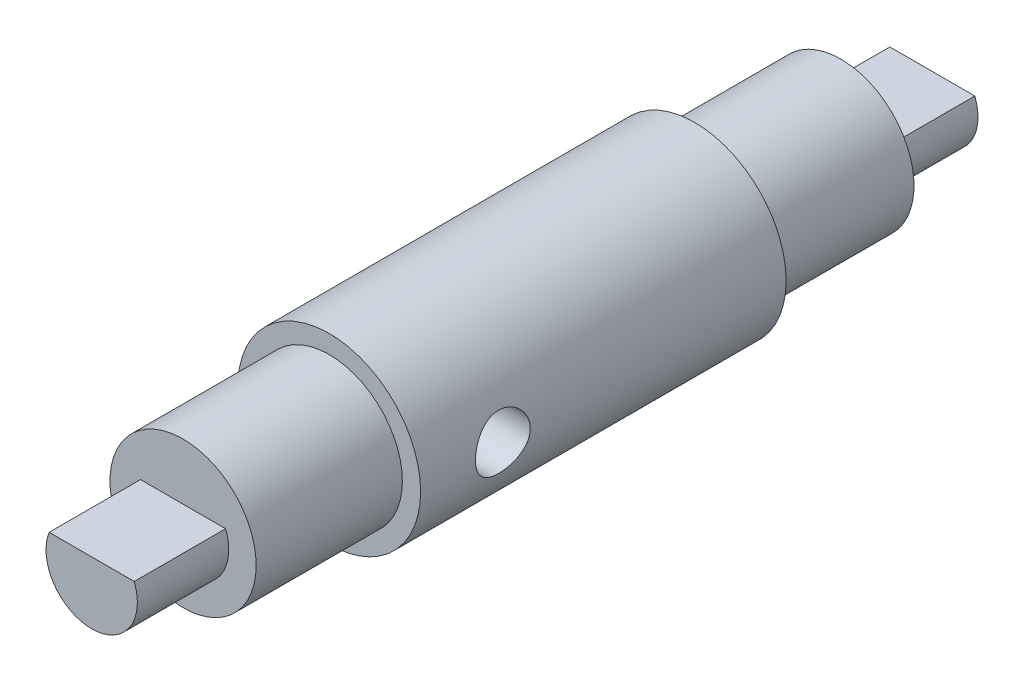
ISO-10303-21;
HEADER;
FILE_DESCRIPTION(('STEP AP214'),'2;1');
FILE_NAME('part.step','',(''),(''),'','','');
FILE_SCHEMA(('AUTOMOTIVE_DESIGN { 1 0 10303 214 1 1 1 1 }'));
ENDSEC;
DATA;
#1=APPLICATION_CONTEXT('core data for automotive mechanical design processes');
#2=APPLICATION_PROTOCOL_DEFINITION('international standard','automotive_design',2000,#1);
#3=PRODUCT_CONTEXT('',#1,'mechanical');
#4=PRODUCT('Part','Part','',(#3));
#5=PRODUCT_RELATED_PRODUCT_CATEGORY('part','',(#4));
#6=PRODUCT_DEFINITION_FORMATION('','',#4);
#7=PRODUCT_DEFINITION_CONTEXT('part definition',#1,'design');
#8=PRODUCT_DEFINITION('design','',#6,#7);
#9=PRODUCT_DEFINITION_SHAPE('','',#8);
#10=(LENGTH_UNIT() NAMED_UNIT(*) SI_UNIT(.MILLI.,.METRE.));
#11=(NAMED_UNIT(*) PLANE_ANGLE_UNIT() SI_UNIT($,.RADIAN.));
#12=(NAMED_UNIT(*) SI_UNIT($,.STERADIAN.) SOLID_ANGLE_UNIT());
#13=UNCERTAINTY_MEASURE_WITH_UNIT(LENGTH_MEASURE(1.E-05),#10,'distance_accuracy_value','');
#14=(GEOMETRIC_REPRESENTATION_CONTEXT(3) GLOBAL_UNCERTAINTY_ASSIGNED_CONTEXT((#13)) GLOBAL_UNIT_ASSIGNED_CONTEXT((#10,
#11,#12)) REPRESENTATION_CONTEXT('',''));
#15=CARTESIAN_POINT('',(0.,0.,0.));
#16=DIRECTION('',(0.,0.,1.));
#17=DIRECTION('',(1.,0.,0.));
#18=AXIS2_PLACEMENT_3D('',#15,#16,#17);
#19=CARTESIAN_POINT('',(0.,0.,20.));
#20=DIRECTION('',(0.,0.,-1.));
#21=DIRECTION('',(-1.,0.,0.));
#22=AXIS2_PLACEMENT_3D('',#19,#20,#21);
#23=CYLINDRICAL_SURFACE('',#22,5.);
#24=CARTESIAN_POINT('',(5.,0.,17.));
#25=CARTESIAN_POINT('',(4.9999992925055,0.0822886127532998,16.9999990025151));
#26=CARTESIAN_POINT('',(4.99794915693954,0.164587318351529,16.993206136376));
#27=CARTESIAN_POINT('',(4.98997105593691,0.32678812530488,16.9662786457779));
#28=CARTESIAN_POINT('',(4.98404193389692,0.406689504411419,16.9461400419767));
#29=CARTESIAN_POINT('',(4.96895552501836,0.561732707754525,16.8932539830897));
#30=CARTESIAN_POINT('',(4.95980300250425,0.636881364395371,16.8605251303811));
#31=CARTESIAN_POINT('',(4.93922109237645,0.78062418105313,16.7834639069442));
#32=CARTESIAN_POINT('',(4.92779140192067,0.849217467469667,16.7391299926046));
#33=CARTESIAN_POINT('',(4.90350737192774,0.979871797183742,16.6387759925273));
#34=CARTESIAN_POINT('',(4.89062383657036,1.04171807124434,16.5824833741141));
#35=CARTESIAN_POINT('',(4.86505834210442,1.15524920923323,16.4603907700898));
#36=CARTESIAN_POINT('',(4.85237641724501,1.20693236327441,16.394589187875));
#37=CARTESIAN_POINT('',(4.82834113993772,1.29980037723707,16.2535292469624));
#38=CARTESIAN_POINT('',(4.81702406663875,1.34072309022213,16.1780915390093));
#39=CARTESIAN_POINT('',(4.79743620394031,1.4092139477476,16.0210107457697));
#40=CARTESIAN_POINT('',(4.78916468313311,1.43678529919973,15.939369156072));
#41=CARTESIAN_POINT('',(4.77690870838434,1.47701633682652,15.7746097338695));
#42=CARTESIAN_POINT('',(4.77281069324533,1.49007196234677,15.6915972561361));
#43=CARTESIAN_POINT('',(4.76902789749767,1.50213730614672,15.5244668437832));
#44=CARTESIAN_POINT('',(4.76934204760571,1.50115042761078,15.4403491819409));
#45=CARTESIAN_POINT('',(4.77424744067778,1.48546977199812,15.2766160913915));
#46=CARTESIAN_POINT('',(4.77868388599141,1.47127205262685,15.1969477496378));
#47=CARTESIAN_POINT('',(4.79108356228624,1.43037420427056,15.0411802137265));
#48=CARTESIAN_POINT('',(4.79904714132351,1.40367284141641,14.9650813726257));
#49=CARTESIAN_POINT('',(4.81772733074973,1.33816026653682,14.8173996503393));
#50=CARTESIAN_POINT('',(4.82848016115952,1.29918816934642,14.7458929160447));
#51=CARTESIAN_POINT('',(4.85150987000065,1.21035222588683,14.6102679779898));
#52=CARTESIAN_POINT('',(4.86378711746991,1.16048574002588,14.5461515705862));
#53=CARTESIAN_POINT('',(4.88911011297937,1.04881290765546,14.424313809238));
#54=CARTESIAN_POINT('',(4.90216654310498,0.986594907466971,14.3669713359703));
#55=CARTESIAN_POINT('',(4.92712244063259,0.853263259313966,14.2634460159358));
#56=CARTESIAN_POINT('',(4.9390218351841,0.782149051860888,14.2172638715856));
#57=CARTESIAN_POINT('',(4.9604316006947,0.632355038342803,14.1371400775353));
#58=CARTESIAN_POINT('',(4.96992543668314,0.553627749747951,14.1032824837501));
#59=CARTESIAN_POINT('',(4.98533521832222,0.391245415603519,14.0494004099004));
#60=CARTESIAN_POINT('',(4.99125216186999,0.307591751589581,14.0293720714675));
#61=CARTESIAN_POINT('',(4.99868364643538,0.140952242668331,14.0043478221006));
#62=CARTESIAN_POINT('',(5.0003485041779,0.0580500976011864,13.9988384141984));
#63=CARTESIAN_POINT('',(4.9995292324176,-0.107499605823383,14.0015691557121));
#64=CARTESIAN_POINT('',(4.99704565677756,-0.19014719669078,14.0098074696514));
#65=CARTESIAN_POINT('',(4.98830696987163,-0.350903605309696,14.0393846111115));
#66=CARTESIAN_POINT('',(4.98213829799417,-0.429072772614169,14.0604233875809));
#67=CARTESIAN_POINT('',(4.96674347841533,-0.580754638954521,14.1146432327782));
#68=CARTESIAN_POINT('',(4.95751696321085,-0.654266777025582,14.1478257610379));
#69=CARTESIAN_POINT('',(4.93669654351325,-0.796437189461051,14.2262531654811));
#70=CARTESIAN_POINT('',(4.92505280829675,-0.864943826199669,14.271759340948));
#71=CARTESIAN_POINT('',(4.90073468764318,-0.993523307980146,14.3732247540528));
#72=CARTESIAN_POINT('',(4.8880600443108,-1.05359403235593,14.4291866118877));
#73=CARTESIAN_POINT('',(4.86253171869138,-1.16585744551027,14.5523873083693));
#74=CARTESIAN_POINT('',(4.84968825033268,-1.21768481231503,14.6199618757717));
#75=CARTESIAN_POINT('',(4.82576515238463,-1.30928995072153,14.7631279390135));
#76=CARTESIAN_POINT('',(4.81468547654651,-1.34906803829472,14.8387192245582));
#77=CARTESIAN_POINT('',(4.79567189615055,-1.41517347127168,14.9955324912547));
#78=CARTESIAN_POINT('',(4.78772337843827,-1.4415634693705,15.0767261865366));
#79=CARTESIAN_POINT('',(4.77591594362794,-1.48021730815114,15.2426879689315));
#80=CARTESIAN_POINT('',(4.772055625083,-1.49248598978779,15.3274548207877));
#81=CARTESIAN_POINT('',(4.76899972496087,-1.50221984485059,15.4943615183762));
#82=CARTESIAN_POINT('',(4.76961647442754,-1.5002805530849,15.5764636510176));
#83=CARTESIAN_POINT('',(4.77499401288294,-1.48307505444813,15.7391141033728));
#84=CARTESIAN_POINT('',(4.77975463592551,-1.46780938124716,15.8196624851764));
#85=CARTESIAN_POINT('',(4.79275763670386,-1.42476888804136,15.9759453991429));
#86=CARTESIAN_POINT('',(4.80095604545965,-1.39715175507068,16.0517272873617));
#87=CARTESIAN_POINT('',(4.81990278909136,-1.33031507121129,16.1976424388177));
#88=CARTESIAN_POINT('',(4.83065161194312,-1.29109329962876,16.2677746176408));
#89=CARTESIAN_POINT('',(4.85397676425833,-1.20048763805072,16.4031631165271));
#90=CARTESIAN_POINT('',(4.86660540163798,-1.14871276092994,16.4681487612604));
#91=CARTESIAN_POINT('',(4.89201320450026,-1.03517434629782,16.5887024983079));
#92=CARTESIAN_POINT('',(4.90479240823905,-0.973408217134498,16.6442681394678));
#93=CARTESIAN_POINT('',(4.92950936570649,-0.839465762183245,16.746023412295));
#94=CARTESIAN_POINT('',(4.94141159765674,-0.767037885790606,16.7918914468555));
#95=CARTESIAN_POINT('',(4.96260680455813,-0.615141373983529,16.870735169904));
#96=CARTESIAN_POINT('',(4.97190099931067,-0.535676052998955,16.9037168882745));
#97=CARTESIAN_POINT('',(4.98602174969301,-0.380757712655282,16.9528952756527));
#98=CARTESIAN_POINT('',(4.99122027381068,-0.305786961954234,16.9705116728832));
#99=CARTESIAN_POINT('',(4.99820944494492,-0.15388019523078,16.9940635252416));
#100=CARTESIAN_POINT('',(5.0000006615474,-0.0769445098581397,17.0000009327048));
#101=CARTESIAN_POINT('',(5.,0.,17.));
#102=B_SPLINE_CURVE_WITH_KNOTS('',3,(#24,#25,#26,#27,#28,#29,#30,#31,#32,#33,#34,#35,#36,#37,
#38,#39,#40,#41,#42,#43,#44,#45,#46,#47,#48,#49,#50,#51,#52,#53,#54,#55,#56,#57,#58,#59,#60,#61,
#62,#63,#64,#65,#66,#67,#68,#69,#70,#71,#72,#73,#74,#75,#76,#77,#78,#79,#80,#81,#82,#83,#84,#85,
#86,#87,#88,#89,#90,#91,#92,#93,#94,#95,#96,#97,#98,#99,#100,#101),.UNSPECIFIED.,.T.,.F.,(4,2,2,
2,2,2,2,2,2,2,2,2,2,2,2,2,2,2,2,2,2,2,2,2,2,2,2,2,2,2,2,2,2,2,2,2,2,2,4),(0.,0.24658320361261,
0.493239964845999,0.739533676300872,0.9858601644127,1.23855602948191,1.49129437288633,
1.74971481004109,2.00807314543223,2.25919689356599,2.51025978319089,2.75226016697676,
2.99428443658001,3.23962426447119,3.48502360158555,3.74067104048166,3.99633456531071,
4.25371046881688,4.51101453528807,4.75908809438545,5.00712853550326,5.24956746682326,
5.49203554593728,5.74011305702908,5.9882528200019,6.24540400322818,6.5025484425268,
6.75847814951251,7.01432009460282,7.25950155466942,7.50467319661599,7.7468004040272,
7.98897397553106,8.2399692567993,8.49102974897501,8.7494299615667,9.00770911595234,
9.23831691930458,9.46888616948873),.UNSPECIFIED.);
#103=CARTESIAN_POINT('',(5.,0.,17.));
#104=VERTEX_POINT('',#103);
#105=EDGE_CURVE('E104',#104,#104,#102,.T.);
#106=ORIENTED_EDGE('',*,*,#105,.T.);
#107=EDGE_LOOP('',(#106));
#108=FACE_BOUND('',#107,.T.);
#109=CARTESIAN_POINT('',(-5.,0.,17.));
#110=CARTESIAN_POINT('',(-4.9999992925055,-0.0822886127532999,16.9999990025151));
#111=CARTESIAN_POINT('',(-4.99794915693954,-0.164587318351529,16.993206136376));
#112=CARTESIAN_POINT('',(-4.98997105593691,-0.32678812530488,16.9662786457779));
#113=CARTESIAN_POINT('',(-4.98404193389692,-0.406689504411419,16.9461400419767));
#114=CARTESIAN_POINT('',(-4.96895552501836,-0.561732707754525,16.8932539830897));
#115=CARTESIAN_POINT('',(-4.95980300250425,-0.636881364395371,16.8605251303811));
#116=CARTESIAN_POINT('',(-4.93922109237645,-0.780624181053129,16.7834639069442));
#117=CARTESIAN_POINT('',(-4.92779140192067,-0.849217467469667,16.7391299926046));
#118=CARTESIAN_POINT('',(-4.90350737192774,-0.979871797183743,16.6387759925273));
#119=CARTESIAN_POINT('',(-4.89062383657036,-1.04171807124434,16.5824833741141));
#120=CARTESIAN_POINT('',(-4.86505834210442,-1.15524920923323,16.4603907700898));
#121=CARTESIAN_POINT('',(-4.85237641724501,-1.20693236327441,16.394589187875));
#122=CARTESIAN_POINT('',(-4.82834113993772,-1.29980037723707,16.2535292469624));
#123=CARTESIAN_POINT('',(-4.81702406663875,-1.34072309022213,16.1780915390093));
#124=CARTESIAN_POINT('',(-4.79743620394031,-1.4092139477476,16.0210107457697));
#125=CARTESIAN_POINT('',(-4.78916468313311,-1.43678529919973,15.939369156072));
#126=CARTESIAN_POINT('',(-4.77690870838434,-1.47701633682652,15.7746097338695));
#127=CARTESIAN_POINT('',(-4.77281069324533,-1.49007196234677,15.6915972561361));
#128=CARTESIAN_POINT('',(-4.76902789749767,-1.50213730614672,15.5244668437832));
#129=CARTESIAN_POINT('',(-4.76934204760571,-1.50115042761078,15.4403491819409));
#130=CARTESIAN_POINT('',(-4.77424744067778,-1.48546977199812,15.2766160913915));
#131=CARTESIAN_POINT('',(-4.77868388599141,-1.47127205262685,15.1969477496378));
#132=CARTESIAN_POINT('',(-4.79108356228624,-1.43037420427056,15.0411802137265));
#133=CARTESIAN_POINT('',(-4.79904714132351,-1.40367284141641,14.9650813726257));
#134=CARTESIAN_POINT('',(-4.81772733074973,-1.33816026653682,14.8173996503393));
#135=CARTESIAN_POINT('',(-4.82848016115952,-1.29918816934642,14.7458929160447));
#136=CARTESIAN_POINT('',(-4.85150987000065,-1.21035222588683,14.6102679779898));
#137=CARTESIAN_POINT('',(-4.86378711746991,-1.16048574002588,14.5461515705862));
#138=CARTESIAN_POINT('',(-4.88911011297937,-1.04881290765546,14.424313809238));
#139=CARTESIAN_POINT('',(-4.90216654310498,-0.986594907466972,14.3669713359703));
#140=CARTESIAN_POINT('',(-4.92712244063259,-0.853263259313967,14.2634460159358));
#141=CARTESIAN_POINT('',(-4.9390218351841,-0.782149051860888,14.2172638715856));
#142=CARTESIAN_POINT('',(-4.9604316006947,-0.632355038342803,14.1371400775353));
#143=CARTESIAN_POINT('',(-4.96992543668314,-0.553627749747951,14.1032824837501));
#144=CARTESIAN_POINT('',(-4.98533521832222,-0.39124541560352,14.0494004099004));
#145=CARTESIAN_POINT('',(-4.99125216186999,-0.307591751589581,14.0293720714675));
#146=CARTESIAN_POINT('',(-4.99868364643538,-0.140952242668331,14.0043478221006));
#147=CARTESIAN_POINT('',(-5.0003485041779,-0.0580500976011866,13.9988384141984));
#148=CARTESIAN_POINT('',(-4.9995292324176,0.107499605823383,14.0015691557121));
#149=CARTESIAN_POINT('',(-4.99704565677756,0.19014719669078,14.0098074696514));
#150=CARTESIAN_POINT('',(-4.98830696987163,0.350903605309696,14.0393846111115));
#151=CARTESIAN_POINT('',(-4.98213829799417,0.429072772614168,14.0604233875809));
#152=CARTESIAN_POINT('',(-4.96674347841533,0.580754638954521,14.1146432327782));
#153=CARTESIAN_POINT('',(-4.95751696321085,0.654266777025582,14.1478257610379));
#154=CARTESIAN_POINT('',(-4.93669654351325,0.796437189461051,14.2262531654811));
#155=CARTESIAN_POINT('',(-4.92505280829675,0.864943826199669,14.271759340948));
#156=CARTESIAN_POINT('',(-4.90073468764318,0.993523307980146,14.3732247540528));
#157=CARTESIAN_POINT('',(-4.8880600443108,1.05359403235593,14.4291866118877));
#158=CARTESIAN_POINT('',(-4.86253171869138,1.16585744551027,14.5523873083693));
#159=CARTESIAN_POINT('',(-4.84968825033268,1.21768481231503,14.6199618757717));
#160=CARTESIAN_POINT('',(-4.82576515238463,1.30928995072153,14.7631279390135));
#161=CARTESIAN_POINT('',(-4.81468547654651,1.34906803829472,14.8387192245582));
#162=CARTESIAN_POINT('',(-4.79567189615055,1.41517347127168,14.9955324912547));
#163=CARTESIAN_POINT('',(-4.78772337843827,1.4415634693705,15.0767261865366));
#164=CARTESIAN_POINT('',(-4.77591594362794,1.48021730815114,15.2426879689315));
#165=CARTESIAN_POINT('',(-4.772055625083,1.49248598978779,15.3274548207877));
#166=CARTESIAN_POINT('',(-4.76899972496087,1.50221984485059,15.4943615183762));
#167=CARTESIAN_POINT('',(-4.76961647442754,1.5002805530849,15.5764636510176));
#168=CARTESIAN_POINT('',(-4.77499401288294,1.48307505444813,15.7391141033728));
#169=CARTESIAN_POINT('',(-4.77975463592551,1.46780938124716,15.8196624851764));
#170=CARTESIAN_POINT('',(-4.79275763670386,1.42476888804136,15.9759453991429));
#171=CARTESIAN_POINT('',(-4.80095604545965,1.39715175507068,16.0517272873617));
#172=CARTESIAN_POINT('',(-4.81990278909136,1.33031507121129,16.1976424388177));
#173=CARTESIAN_POINT('',(-4.83065161194312,1.29109329962876,16.2677746176408));
#174=CARTESIAN_POINT('',(-4.85397676425833,1.20048763805072,16.4031631165271));
#175=CARTESIAN_POINT('',(-4.86660540163798,1.14871276092993,16.4681487612604));
#176=CARTESIAN_POINT('',(-4.89201320450026,1.03517434629781,16.5887024983079));
#177=CARTESIAN_POINT('',(-4.90479240823905,0.973408217134497,16.6442681394678));
#178=CARTESIAN_POINT('',(-4.92950936570649,0.839465762183246,16.746023412295));
#179=CARTESIAN_POINT('',(-4.94141159765674,0.767037885790606,16.7918914468555));
#180=CARTESIAN_POINT('',(-4.96260680455813,0.61514137398353,16.870735169904));
#181=CARTESIAN_POINT('',(-4.97190099931067,0.535676052998955,16.9037168882745));
#182=CARTESIAN_POINT('',(-4.98602174969301,0.380757712655282,16.9528952756527));
#183=CARTESIAN_POINT('',(-4.99122027381068,0.305786961954235,16.9705116728832));
#184=CARTESIAN_POINT('',(-4.99820944494492,0.15388019523078,16.9940635252416));
#185=CARTESIAN_POINT('',(-5.0000006615474,0.0769445098581401,17.0000009327048));
#186=CARTESIAN_POINT('',(-5.,0.,17.));
#187=B_SPLINE_CURVE_WITH_KNOTS('',3,(#109,#110,#111,#112,#113,#114,#115,#116,#117,#118,#119,
#120,#121,#122,#123,#124,#125,#126,#127,#128,#129,#130,#131,#132,#133,#134,#135,#136,#137,#138,
#139,#140,#141,#142,#143,#144,#145,#146,#147,#148,#149,#150,#151,#152,#153,#154,#155,#156,#157,
#158,#159,#160,#161,#162,#163,#164,#165,#166,#167,#168,#169,#170,#171,#172,#173,#174,#175,#176,
#177,#178,#179,#180,#181,#182,#183,#184,#185,#186),.UNSPECIFIED.,.T.,.F.,(4,2,2,2,2,2,2,2,2,2,2,
2,2,2,2,2,2,2,2,2,2,2,2,2,2,2,2,2,2,2,2,2,2,2,2,2,2,2,4),(0.,0.24658320361261,0.493239964845999,
0.739533676300872,0.9858601644127,1.23855602948191,1.49129437288633,1.74971481004109,
2.00807314543223,2.25919689356599,2.51025978319089,2.75226016697676,2.99428443658001,
3.23962426447119,3.48502360158555,3.74067104048166,3.99633456531071,4.25371046881688,
4.51101453528807,4.75908809438545,5.00712853550326,5.24956746682326,5.49203554593728,
5.74011305702908,5.9882528200019,6.24540400322818,6.5025484425268,6.75847814951251,
7.01432009460282,7.25950155466942,7.50467319661599,7.7468004040272,7.98897397553107,
8.23996925679931,8.49102974897502,8.7494299615667,9.00770911595234,9.23831691930459,
9.46888616948874),.UNSPECIFIED.);
#188=CARTESIAN_POINT('',(-5.,0.,17.));
#189=VERTEX_POINT('',#188);
#190=EDGE_CURVE('E48',#189,#189,#187,.T.);
#191=ORIENTED_EDGE('',*,*,#190,.T.);
#192=EDGE_LOOP('',(#191));
#193=FACE_BOUND('',#192,.T.);
#194=CARTESIAN_POINT('',(0.,0.,20.));
#195=DIRECTION('',(0.,0.,1.));
#196=DIRECTION('',(1.,0.,0.));
#197=AXIS2_PLACEMENT_3D('',#194,#195,#196);
#198=CIRCLE('',#197,5.);
#199=CARTESIAN_POINT('',(5.,0.,20.));
#200=VERTEX_POINT('',#199);
#201=EDGE_CURVE('E120',#200,#200,#198,.T.);
#202=ORIENTED_EDGE('',*,*,#201,.F.);
#203=EDGE_LOOP('',(#202));
#204=FACE_BOUND('',#203,.T.);
#205=CARTESIAN_POINT('',(0.,0.,0.));
#206=DIRECTION('',(0.,0.,1.));
#207=DIRECTION('',(1.,0.,0.));
#208=AXIS2_PLACEMENT_3D('',#205,#206,#207);
#209=CIRCLE('',#208,5.);
#210=CARTESIAN_POINT('',(5.,0.,0.));
#211=VERTEX_POINT('',#210);
#212=EDGE_CURVE('E119',#211,#211,#209,.T.);
#213=ORIENTED_EDGE('',*,*,#212,.T.);
#214=EDGE_LOOP('',(#213));
#215=FACE_BOUND('',#214,.T.);
#216=ADVANCED_FACE('F40',(#108,#193,#204,#215),#23,.T.);
#217=CARTESIAN_POINT('',(0.,0.,20.));
#218=DIRECTION('',(0.,0.,1.));
#219=DIRECTION('',(1.,0.,0.));
#220=AXIS2_PLACEMENT_3D('',#217,#218,#219);
#221=PLANE('',#220);
#222=CARTESIAN_POINT('',(0.,0.,20.));
#223=DIRECTION('',(0.,0.,1.));
#224=DIRECTION('',(1.,0.,0.));
#225=AXIS2_PLACEMENT_3D('',#222,#223,#224);
#226=CIRCLE('',#225,4.);
#227=CARTESIAN_POINT('',(4.,0.,20.));
#228=VERTEX_POINT('',#227);
#229=EDGE_CURVE('E11',#228,#228,#226,.T.);
#230=ORIENTED_EDGE('',*,*,#229,.F.);
#231=EDGE_LOOP('',(#230));
#232=FACE_BOUND('',#231,.T.);
#233=ORIENTED_EDGE('',*,*,#201,.T.);
#234=EDGE_LOOP('',(#233));
#235=FACE_BOUND('',#234,.T.);
#236=ADVANCED_FACE('F168',(#232,#235),#221,.T.);
#237=CARTESIAN_POINT('',(0.,0.,0.));
#238=DIRECTION('',(0.,0.,1.));
#239=DIRECTION('',(1.,0.,0.));
#240=AXIS2_PLACEMENT_3D('',#237,#238,#239);
#241=PLANE('',#240);
#242=CARTESIAN_POINT('',(0.,0.,0.));
#243=DIRECTION('',(0.,0.,1.));
#244=DIRECTION('',(1.,0.,0.));
#245=AXIS2_PLACEMENT_3D('',#242,#243,#244);
#246=CIRCLE('',#245,4.);
#247=CARTESIAN_POINT('',(4.,0.,0.));
#248=VERTEX_POINT('',#247);
#249=EDGE_CURVE('E101',#248,#248,#246,.F.);
#250=ORIENTED_EDGE('',*,*,#249,.F.);
#251=EDGE_LOOP('',(#250));
#252=FACE_BOUND('',#251,.T.);
#253=ORIENTED_EDGE('',*,*,#212,.F.);
#254=EDGE_LOOP('',(#253));
#255=FACE_BOUND('',#254,.T.);
#256=ADVANCED_FACE('F139',(#252,#255),#241,.F.);
#257=CARTESIAN_POINT('',(10.,0.,15.5));
#258=DIRECTION('',(-1.,0.,0.));
#259=DIRECTION('',(0.,0.,1.));
#260=AXIS2_PLACEMENT_3D('',#257,#258,#259);
#261=CYLINDRICAL_SURFACE('',#260,1.5);
#262=ORIENTED_EDGE('',*,*,#105,.F.);
#263=EDGE_LOOP('',(#262));
#264=FACE_BOUND('',#263,.T.);
#265=ORIENTED_EDGE('',*,*,#190,.F.);
#266=EDGE_LOOP('',(#265));
#267=FACE_BOUND('',#266,.T.);
#268=ADVANCED_FACE('F133',(#264,#267),#261,.F.);
#269=CARTESIAN_POINT('',(0.,0.,33.002));
#270=DIRECTION('',(0.,0.,-1.));
#271=DIRECTION('',(-1.,0.,0.));
#272=AXIS2_PLACEMENT_3D('',#269,#270,#271);
#273=CYLINDRICAL_SURFACE('',#272,4.);
#274=CARTESIAN_POINT('',(0.,0.,-8.));
#275=DIRECTION('',(0.,0.,-1.));
#276=DIRECTION('',(-1.,0.,0.));
#277=AXIS2_PLACEMENT_3D('',#274,#275,#276);
#278=CIRCLE('',#277,4.);
#279=CARTESIAN_POINT('',(-4.,0.,-8.));
#280=VERTEX_POINT('',#279);
#281=EDGE_CURVE('E191',#280,#280,#278,.T.);
#282=ORIENTED_EDGE('',*,*,#281,.F.);
#283=EDGE_LOOP('',(#282));
#284=FACE_BOUND('',#283,.T.);
#285=ORIENTED_EDGE('',*,*,#249,.T.);
#286=EDGE_LOOP('',(#285));
#287=FACE_BOUND('',#286,.T.);
#288=ADVANCED_FACE('F138',(#284,#287),#273,.T.);
#289=CARTESIAN_POINT('',(0.,0.,-13.));
#290=DIRECTION('',(0.,0.,-1.));
#291=DIRECTION('',(-1.,0.,0.));
#292=AXIS2_PLACEMENT_3D('',#289,#290,#291);
#293=PLANE('',#292);
#294=DIRECTION('',(-1.,0.,0.));
#295=VECTOR('',#294,1.);
#296=CARTESIAN_POINT('',(0.,0.913986653585557,-13.));
#297=LINE('',#296,#295);
#298=CARTESIAN_POINT('',(2.32693540887311,0.913986653585557,-13.));
#299=VERTEX_POINT('',#298);
#300=CARTESIAN_POINT('',(-2.32693540887311,0.913986653585557,-13.));
#301=VERTEX_POINT('',#300);
#302=EDGE_CURVE('E107',#299,#301,#297,.T.);
#303=ORIENTED_EDGE('',*,*,#302,.F.);
#304=CARTESIAN_POINT('',(0.,0.,-13.));
#305=DIRECTION('',(0.,0.,-1.));
#306=DIRECTION('',(-1.,0.,0.));
#307=AXIS2_PLACEMENT_3D('',#304,#305,#306);
#308=CIRCLE('',#307,2.5);
#309=EDGE_CURVE('E110',#299,#301,#308,.T.);
#310=ORIENTED_EDGE('',*,*,#309,.T.);
#311=EDGE_LOOP('',(#303,#310));
#312=FACE_BOUND('',#311,.T.);
#313=ADVANCED_FACE('F151',(#312),#293,.T.);
#314=CARTESIAN_POINT('',(0.,0.913986653585557,-13.));
#315=DIRECTION('',(0.,1.,0.));
#316=DIRECTION('',(0.,0.,1.));
#317=AXIS2_PLACEMENT_3D('',#314,#315,#316);
#318=PLANE('',#317);
#319=DIRECTION('',(-1.,0.,0.));
#320=VECTOR('',#319,1.);
#321=CARTESIAN_POINT('',(0.,0.913986653585557,-8.));
#322=LINE('',#321,#320);
#323=CARTESIAN_POINT('',(2.32693540887311,0.913986653585557,-8.));
#324=VERTEX_POINT('',#323);
#325=CARTESIAN_POINT('',(-2.32693540887311,0.913986653585557,-8.));
#326=VERTEX_POINT('',#325);
#327=EDGE_CURVE('E89',#324,#326,#322,.T.);
#328=ORIENTED_EDGE('',*,*,#327,.F.);
#329=DIRECTION('',(0.,0.,1.));
#330=VECTOR('',#329,1.);
#331=CARTESIAN_POINT('',(2.32693540887311,0.913986653585557,-13.));
#332=LINE('',#331,#330);
#333=EDGE_CURVE('E117',#299,#324,#332,.T.);
#334=ORIENTED_EDGE('',*,*,#333,.F.);
#335=ORIENTED_EDGE('',*,*,#302,.T.);
#336=DIRECTION('',(0.,0.,1.));
#337=VECTOR('',#336,1.);
#338=CARTESIAN_POINT('',(-2.32693540887311,0.913986653585557,-13.));
#339=LINE('',#338,#337);
#340=EDGE_CURVE('E112',#301,#326,#339,.T.);
#341=ORIENTED_EDGE('',*,*,#340,.T.);
#342=EDGE_LOOP('',(#328,#334,#335,#341));
#343=FACE_BOUND('',#342,.T.);
#344=ADVANCED_FACE('F154',(#343),#318,.T.);
#345=CARTESIAN_POINT('',(0.,0.,-13.));
#346=DIRECTION('',(0.,0.,1.));
#347=DIRECTION('',(1.,0.,0.));
#348=AXIS2_PLACEMENT_3D('',#345,#346,#347);
#349=CYLINDRICAL_SURFACE('',#348,2.5);
#350=CARTESIAN_POINT('',(0.,0.,-8.));
#351=DIRECTION('',(0.,0.,-1.));
#352=DIRECTION('',(-1.,0.,0.));
#353=AXIS2_PLACEMENT_3D('',#350,#351,#352);
#354=CIRCLE('',#353,2.5);
#355=EDGE_CURVE('E61',#324,#326,#354,.T.);
#356=ORIENTED_EDGE('',*,*,#355,.T.);
#357=ORIENTED_EDGE('',*,*,#340,.F.);
#358=ORIENTED_EDGE('',*,*,#309,.F.);
#359=ORIENTED_EDGE('',*,*,#333,.T.);
#360=EDGE_LOOP('',(#356,#357,#358,#359));
#361=FACE_BOUND('',#360,.T.);
#362=ADVANCED_FACE('F156',(#361),#349,.T.);
#363=CARTESIAN_POINT('',(0.,0.,-8.));
#364=DIRECTION('',(0.,0.,-1.));
#365=DIRECTION('',(-1.,0.,0.));
#366=AXIS2_PLACEMENT_3D('',#363,#364,#365);
#367=PLANE('',#366);
#368=ORIENTED_EDGE('',*,*,#355,.F.);
#369=ORIENTED_EDGE('',*,*,#327,.T.);
#370=EDGE_LOOP('',(#368,#369));
#371=FACE_BOUND('',#370,.T.);
#372=ORIENTED_EDGE('',*,*,#281,.T.);
#373=EDGE_LOOP('',(#372));
#374=FACE_BOUND('',#373,.T.);
#375=ADVANCED_FACE('F159',(#371,#374),#367,.T.);
#376=CARTESIAN_POINT('',(0.,0.,-13.002));
#377=DIRECTION('',(0.,0.,1.));
#378=DIRECTION('',(1.,0.,0.));
#379=AXIS2_PLACEMENT_3D('',#376,#377,#378);
#380=CYLINDRICAL_SURFACE('',#379,4.);
#381=ORIENTED_EDGE('',*,*,#229,.T.);
#382=EDGE_LOOP('',(#381));
#383=FACE_BOUND('',#382,.T.);
#384=CARTESIAN_POINT('',(0.,0.,28.));
#385=DIRECTION('',(0.,0.,1.));
#386=DIRECTION('',(1.,0.,0.));
#387=AXIS2_PLACEMENT_3D('',#384,#385,#386);
#388=CIRCLE('',#387,4.);
#389=CARTESIAN_POINT('',(4.,0.,28.));
#390=VERTEX_POINT('',#389);
#391=EDGE_CURVE('E196',#390,#390,#388,.T.);
#392=ORIENTED_EDGE('',*,*,#391,.F.);
#393=EDGE_LOOP('',(#392));
#394=FACE_BOUND('',#393,.T.);
#395=ADVANCED_FACE('F145',(#383,#394),#380,.T.);
#396=CARTESIAN_POINT('',(0.,0.,33.));
#397=DIRECTION('',(0.,0.,1.));
#398=DIRECTION('',(1.,0.,0.));
#399=AXIS2_PLACEMENT_3D('',#396,#397,#398);
#400=PLANE('',#399);
#401=DIRECTION('',(1.,0.,0.));
#402=VECTOR('',#401,1.);
#403=CARTESIAN_POINT('',(0.,0.91,33.));
#404=LINE('',#403,#402);
#405=CARTESIAN_POINT('',(-2.32849736954973,0.91,33.));
#406=VERTEX_POINT('',#405);
#407=CARTESIAN_POINT('',(2.32849736954973,0.91,33.));
#408=VERTEX_POINT('',#407);
#409=EDGE_CURVE('E86',#406,#408,#404,.T.);
#410=ORIENTED_EDGE('',*,*,#409,.F.);
#411=CARTESIAN_POINT('',(0.,0.,33.));
#412=DIRECTION('',(0.,0.,1.));
#413=DIRECTION('',(1.,0.,0.));
#414=AXIS2_PLACEMENT_3D('',#411,#412,#413);
#415=CIRCLE('',#414,2.5);
#416=EDGE_CURVE('E93',#406,#408,#415,.T.);
#417=ORIENTED_EDGE('',*,*,#416,.T.);
#418=EDGE_LOOP('',(#410,#417));
#419=FACE_BOUND('',#418,.T.);
#420=ADVANCED_FACE('F97',(#419),#400,.T.);
#421=CARTESIAN_POINT('',(0.,0.91,33.));
#422=DIRECTION('',(0.,1.,0.));
#423=DIRECTION('',(0.,0.,1.));
#424=AXIS2_PLACEMENT_3D('',#421,#422,#423);
#425=PLANE('',#424);
#426=DIRECTION('',(1.,0.,0.));
#427=VECTOR('',#426,1.);
#428=CARTESIAN_POINT('',(0.,0.91,28.));
#429=LINE('',#428,#427);
#430=CARTESIAN_POINT('',(-2.32849736954973,0.91,28.));
#431=VERTEX_POINT('',#430);
#432=CARTESIAN_POINT('',(2.32849736954973,0.91,28.));
#433=VERTEX_POINT('',#432);
#434=EDGE_CURVE('E87',#431,#433,#429,.T.);
#435=ORIENTED_EDGE('',*,*,#434,.F.);
#436=DIRECTION('',(0.,0.,-1.));
#437=VECTOR('',#436,1.);
#438=CARTESIAN_POINT('',(-2.32849736954973,0.91,33.));
#439=LINE('',#438,#437);
#440=EDGE_CURVE('E81',#406,#431,#439,.T.);
#441=ORIENTED_EDGE('',*,*,#440,.F.);
#442=ORIENTED_EDGE('',*,*,#409,.T.);
#443=DIRECTION('',(0.,0.,-1.));
#444=VECTOR('',#443,1.);
#445=CARTESIAN_POINT('',(2.32849736954973,0.91,33.));
#446=LINE('',#445,#444);
#447=EDGE_CURVE('E90',#408,#433,#446,.T.);
#448=ORIENTED_EDGE('',*,*,#447,.T.);
#449=EDGE_LOOP('',(#435,#441,#442,#448));
#450=FACE_BOUND('',#449,.T.);
#451=ADVANCED_FACE('F83',(#450),#425,.T.);
#452=CARTESIAN_POINT('',(0.,0.,33.));
#453=DIRECTION('',(0.,0.,-1.));
#454=DIRECTION('',(-1.,0.,0.));
#455=AXIS2_PLACEMENT_3D('',#452,#453,#454);
#456=CYLINDRICAL_SURFACE('',#455,2.5);
#457=CARTESIAN_POINT('',(0.,0.,28.));
#458=DIRECTION('',(0.,0.,1.));
#459=DIRECTION('',(1.,0.,0.));
#460=AXIS2_PLACEMENT_3D('',#457,#458,#459);
#461=CIRCLE('',#460,2.5);
#462=EDGE_CURVE('E54',#431,#433,#461,.T.);
#463=ORIENTED_EDGE('',*,*,#462,.T.);
#464=ORIENTED_EDGE('',*,*,#447,.F.);
#465=ORIENTED_EDGE('',*,*,#416,.F.);
#466=ORIENTED_EDGE('',*,*,#440,.T.);
#467=EDGE_LOOP('',(#463,#464,#465,#466));
#468=FACE_BOUND('',#467,.T.);
#469=ADVANCED_FACE('F94',(#468),#456,.T.);
#470=CARTESIAN_POINT('',(0.,0.,28.));
#471=DIRECTION('',(0.,0.,1.));
#472=DIRECTION('',(1.,0.,0.));
#473=AXIS2_PLACEMENT_3D('',#470,#471,#472);
#474=PLANE('',#473);
#475=ORIENTED_EDGE('',*,*,#462,.F.);
#476=ORIENTED_EDGE('',*,*,#434,.T.);
#477=EDGE_LOOP('',(#475,#476));
#478=FACE_BOUND('',#477,.T.);
#479=ORIENTED_EDGE('',*,*,#391,.T.);
#480=EDGE_LOOP('',(#479));
#481=FACE_BOUND('',#480,.T.);
#482=ADVANCED_FACE('F148',(#478,#481),#474,.T.);
#483=CLOSED_SHELL('',(#216,#236,#256,#268,#288,#313,#344,#362,#375,#395,#420,#451,#469,#482));
#484=MANIFOLD_SOLID_BREP('B2',#483);
#485=ADVANCED_BREP_SHAPE_REPRESENTATION('',(#18,#484),#14);
#486=SHAPE_DEFINITION_REPRESENTATION(#9,#485);
ENDSEC;
END-ISO-10303-21;
